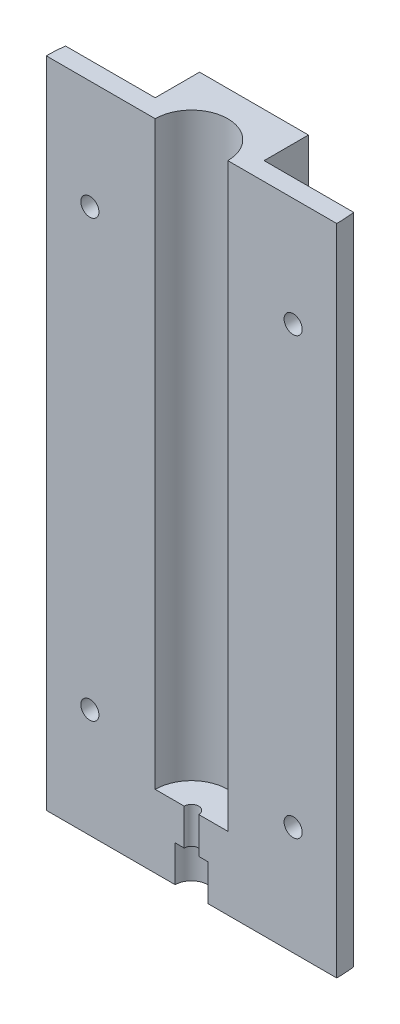
ISO-10303-21;
HEADER;
FILE_DESCRIPTION(('STEP AP214'),'2;1');
FILE_NAME('part.step','',(''),(''),'','','');
FILE_SCHEMA(('AUTOMOTIVE_DESIGN { 1 0 10303 214 1 1 1 1 }'));
ENDSEC;
DATA;
#1=APPLICATION_CONTEXT('core data for automotive mechanical design processes');
#2=APPLICATION_PROTOCOL_DEFINITION('international standard','automotive_design',2000,#1);
#3=PRODUCT_CONTEXT('',#1,'mechanical');
#4=PRODUCT('Part','Part','',(#3));
#5=PRODUCT_RELATED_PRODUCT_CATEGORY('part','',(#4));
#6=PRODUCT_DEFINITION_FORMATION('','',#4);
#7=PRODUCT_DEFINITION_CONTEXT('part definition',#1,'design');
#8=PRODUCT_DEFINITION('design','',#6,#7);
#9=PRODUCT_DEFINITION_SHAPE('','',#8);
#10=(LENGTH_UNIT() NAMED_UNIT(*) SI_UNIT(.MILLI.,.METRE.));
#11=(NAMED_UNIT(*) PLANE_ANGLE_UNIT() SI_UNIT($,.RADIAN.));
#12=(NAMED_UNIT(*) SI_UNIT($,.STERADIAN.) SOLID_ANGLE_UNIT());
#13=UNCERTAINTY_MEASURE_WITH_UNIT(LENGTH_MEASURE(1.E-05),#10,'distance_accuracy_value','');
#14=(GEOMETRIC_REPRESENTATION_CONTEXT(3) GLOBAL_UNCERTAINTY_ASSIGNED_CONTEXT((#13)) GLOBAL_UNIT_ASSIGNED_CONTEXT((#10,
#11,#12)) REPRESENTATION_CONTEXT('',''));
#15=CARTESIAN_POINT('',(0.,0.,0.));
#16=DIRECTION('',(0.,0.,1.));
#17=DIRECTION('',(1.,0.,0.));
#18=AXIS2_PLACEMENT_3D('',#15,#16,#17);
#19=CARTESIAN_POINT('',(20.,-0.0001,0.));
#20=DIRECTION('',(0.,1.,0.));
#21=DIRECTION('',(0.,0.,1.));
#22=AXIS2_PLACEMENT_3D('',#19,#20,#21);
#23=CYLINDRICAL_SURFACE('',#22,20.);
#24=DIRECTION('',(0.,1.,0.));
#25=VECTOR('',#24,1.);
#26=CARTESIAN_POINT('',(0.156865167015571,-131.873657205707,-2.5));
#27=LINE('',#26,#25);
#28=CARTESIAN_POINT('',(0.156865167015571,-0.000100000000002876,-2.5));
#29=VERTEX_POINT('',#28);
#30=CARTESIAN_POINT('',(0.156865167015571,90.0000000000001,-2.5));
#31=VERTEX_POINT('',#30);
#32=EDGE_CURVE('E154',#29,#31,#27,.T.);
#33=ORIENTED_EDGE('',*,*,#32,.F.);
#34=CARTESIAN_POINT('',(20.,-0.0001,0.));
#35=DIRECTION('',(0.,1.,0.));
#36=DIRECTION('',(0.,0.,-1.));
#37=AXIS2_PLACEMENT_3D('',#34,#35,#36);
#38=CIRCLE('',#37,20.);
#39=CARTESIAN_POINT('',(0.,-0.0001,0.));
#40=VERTEX_POINT('',#39);
#41=EDGE_CURVE('E160',#29,#40,#38,.T.);
#42=ORIENTED_EDGE('',*,*,#41,.T.);
#43=DIRECTION('',(0.,1.,0.));
#44=VECTOR('',#43,1.);
#45=CARTESIAN_POINT('',(0.,-0.0001,0.));
#46=LINE('',#45,#44);
#47=CARTESIAN_POINT('',(0.,90.0000000000001,0.));
#48=VERTEX_POINT('',#47);
#49=EDGE_CURVE('E169',#40,#48,#46,.T.);
#50=ORIENTED_EDGE('',*,*,#49,.T.);
#51=CARTESIAN_POINT('',(20.,90.0000000000001,0.));
#52=DIRECTION('',(0.,1.,0.));
#53=DIRECTION('',(0.,0.,-1.));
#54=AXIS2_PLACEMENT_3D('',#51,#52,#53);
#55=CIRCLE('',#54,20.);
#56=EDGE_CURVE('E242',#31,#48,#55,.T.);
#57=ORIENTED_EDGE('',*,*,#56,.F.);
#58=EDGE_LOOP('',(#33,#42,#50,#57));
#59=FACE_BOUND('',#58,.T.);
#60=ADVANCED_FACE('F33',(#59),#23,.T.);
#61=CARTESIAN_POINT('',(20.,-31.3608864858859,0.));
#62=DIRECTION('',(0.,1.,0.));
#63=DIRECTION('',(0.,0.,1.));
#64=AXIS2_PLACEMENT_3D('',#61,#62,#63);
#65=CYLINDRICAL_SURFACE('',#64,0.999999999999999);
#66=CARTESIAN_POINT('',(20.,4.99989999999999,0.));
#67=DIRECTION('',(0.,-1.,0.));
#68=DIRECTION('',(0.,0.,-1.));
#69=AXIS2_PLACEMENT_3D('',#66,#67,#68);
#70=CIRCLE('',#69,0.999999999999999);
#71=CARTESIAN_POINT('',(21.,4.99989999999999,0.));
#72=VERTEX_POINT('',#71);
#73=CARTESIAN_POINT('',(19.,4.99989999999999,0.));
#74=VERTEX_POINT('',#73);
#75=EDGE_CURVE('E171',#72,#74,#70,.F.);
#76=ORIENTED_EDGE('',*,*,#75,.F.);
#77=DIRECTION('',(0.,1.,0.));
#78=VECTOR('',#77,1.);
#79=CARTESIAN_POINT('',(21.,-31.3608864858859,0.));
#80=LINE('',#79,#78);
#81=CARTESIAN_POINT('',(21.,10.,0.));
#82=VERTEX_POINT('',#81);
#83=EDGE_CURVE('E227',#72,#82,#80,.T.);
#84=ORIENTED_EDGE('',*,*,#83,.T.);
#85=CARTESIAN_POINT('',(20.,10.,0.));
#86=DIRECTION('',(0.,1.,0.));
#87=DIRECTION('',(0.,0.,-1.));
#88=AXIS2_PLACEMENT_3D('',#85,#86,#87);
#89=CIRCLE('',#88,0.999999999999999);
#90=CARTESIAN_POINT('',(19.,10.,0.));
#91=VERTEX_POINT('',#90);
#92=EDGE_CURVE('E223',#82,#91,#89,.T.);
#93=ORIENTED_EDGE('',*,*,#92,.T.);
#94=DIRECTION('',(0.,1.,0.));
#95=VECTOR('',#94,1.);
#96=CARTESIAN_POINT('',(19.,-31.3608864858859,0.));
#97=LINE('',#96,#95);
#98=EDGE_CURVE('E226',#74,#91,#97,.T.);
#99=ORIENTED_EDGE('',*,*,#98,.F.);
#100=EDGE_LOOP('',(#76,#84,#93,#99));
#101=FACE_BOUND('',#100,.T.);
#102=ADVANCED_FACE('F278',(#101),#65,.F.);
#103=CARTESIAN_POINT('',(0.,-0.0001,0.));
#104=DIRECTION('',(0.,0.,1.));
#105=DIRECTION('',(1.,0.,0.));
#106=AXIS2_PLACEMENT_3D('',#103,#104,#105);
#107=PLANE('',#106);
#108=CARTESIAN_POINT('',(34.,75.0000000000001,0.));
#109=DIRECTION('',(0.,0.,1.));
#110=DIRECTION('',(1.,0.,0.));
#111=AXIS2_PLACEMENT_3D('',#108,#109,#110);
#112=CIRCLE('',#111,1.24999999999999);
#113=CARTESIAN_POINT('',(35.25,75.0000000000001,0.));
#114=VERTEX_POINT('',#113);
#115=EDGE_CURVE('E313',#114,#114,#112,.T.);
#116=ORIENTED_EDGE('',*,*,#115,.F.);
#117=EDGE_LOOP('',(#116));
#118=FACE_BOUND('',#117,.T.);
#119=CARTESIAN_POINT('',(34.,15.,0.));
#120=DIRECTION('',(0.,0.,1.));
#121=DIRECTION('',(1.,0.,0.));
#122=AXIS2_PLACEMENT_3D('',#119,#120,#121);
#123=CIRCLE('',#122,1.24999999999999);
#124=CARTESIAN_POINT('',(35.25,15.,0.));
#125=VERTEX_POINT('',#124);
#126=EDGE_CURVE('E324',#125,#125,#123,.T.);
#127=ORIENTED_EDGE('',*,*,#126,.F.);
#128=EDGE_LOOP('',(#127));
#129=FACE_BOUND('',#128,.T.);
#130=DIRECTION('',(0.,-1.,0.));
#131=VECTOR('',#130,1.);
#132=CARTESIAN_POINT('',(22.25,4.99989999999999,0.));
#133=LINE('',#132,#131);
#134=CARTESIAN_POINT('',(22.25,-0.0001,0.));
#135=VERTEX_POINT('',#134);
#136=CARTESIAN_POINT('',(22.25,4.99989999999999,0.));
#137=VERTEX_POINT('',#136);
#138=EDGE_CURVE('E221',#135,#137,#133,.F.);
#139=ORIENTED_EDGE('',*,*,#138,.F.);
#140=DIRECTION('',(1.,0.,0.));
#141=VECTOR('',#140,1.);
#142=CARTESIAN_POINT('',(0.,-0.0001,0.));
#143=LINE('',#142,#141);
#144=CARTESIAN_POINT('',(40.,-0.0001,0.));
#145=VERTEX_POINT('',#144);
#146=EDGE_CURVE('E159',#135,#145,#143,.T.);
#147=ORIENTED_EDGE('',*,*,#146,.T.);
#148=DIRECTION('',(0.,1.,0.));
#149=VECTOR('',#148,1.);
#150=CARTESIAN_POINT('',(40.,-0.0001,0.));
#151=LINE('',#150,#149);
#152=CARTESIAN_POINT('',(40.,90.0000000000001,0.));
#153=VERTEX_POINT('',#152);
#154=EDGE_CURVE('E158',#145,#153,#151,.T.);
#155=ORIENTED_EDGE('',*,*,#154,.T.);
#156=DIRECTION('',(1.,0.,0.));
#157=VECTOR('',#156,1.);
#158=CARTESIAN_POINT('',(0.,90.0000000000001,0.));
#159=LINE('',#158,#157);
#160=CARTESIAN_POINT('',(25.,90.0000000000001,0.));
#161=VERTEX_POINT('',#160);
#162=EDGE_CURVE('E245',#161,#153,#159,.T.);
#163=ORIENTED_EDGE('',*,*,#162,.F.);
#164=DIRECTION('',(0.,1.,0.));
#165=VECTOR('',#164,1.);
#166=CARTESIAN_POINT('',(25.,10.,0.));
#167=LINE('',#166,#165);
#168=CARTESIAN_POINT('',(25.,10.,0.));
#169=VERTEX_POINT('',#168);
#170=EDGE_CURVE('E240',#169,#161,#167,.T.);
#171=ORIENTED_EDGE('',*,*,#170,.F.);
#172=DIRECTION('',(-1.,0.,0.));
#173=VECTOR('',#172,1.);
#174=CARTESIAN_POINT('',(25.,10.,0.));
#175=LINE('',#174,#173);
#176=EDGE_CURVE('E235',#169,#82,#175,.T.);
#177=ORIENTED_EDGE('',*,*,#176,.T.);
#178=ORIENTED_EDGE('',*,*,#83,.F.);
#179=DIRECTION('',(1.,0.,0.));
#180=VECTOR('',#179,1.);
#181=CARTESIAN_POINT('',(0.,4.99989999999999,0.));
#182=LINE('',#181,#180);
#183=EDGE_CURVE('E56',#72,#137,#182,.T.);
#184=ORIENTED_EDGE('',*,*,#183,.T.);
#185=EDGE_LOOP('',(#139,#147,#155,#163,#171,#177,#178,#184));
#186=FACE_BOUND('',#185,.T.);
#187=ADVANCED_FACE('F269',(#118,#129,#186),#107,.T.);
#188=DIRECTION('',(0.,1.,0.));
#189=VECTOR('',#188,1.);
#190=CARTESIAN_POINT('',(39.8431348329844,-131.873657205707,-2.5));
#191=LINE('',#190,#189);
#192=CARTESIAN_POINT('',(39.8431348329844,-0.000100000000002876,-2.5));
#193=VERTEX_POINT('',#192);
#194=CARTESIAN_POINT('',(39.8431348329844,90.0000000000001,-2.5));
#195=VERTEX_POINT('',#194);
#196=EDGE_CURVE('E133',#193,#195,#191,.T.);
#197=ORIENTED_EDGE('',*,*,#196,.T.);
#198=EDGE_CURVE('E244',#153,#195,#55,.T.);
#199=ORIENTED_EDGE('',*,*,#198,.F.);
#200=ORIENTED_EDGE('',*,*,#154,.F.);
#201=EDGE_CURVE('E151',#145,#193,#38,.T.);
#202=ORIENTED_EDGE('',*,*,#201,.T.);
#203=EDGE_LOOP('',(#197,#199,#200,#202));
#204=FACE_BOUND('',#203,.T.);
#205=ADVANCED_FACE('F35',(#204),#23,.T.);
#206=CARTESIAN_POINT('',(6.,75.0000000000001,0.));
#207=DIRECTION('',(0.,0.,1.));
#208=DIRECTION('',(1.,0.,0.));
#209=AXIS2_PLACEMENT_3D('',#206,#207,#208);
#210=CIRCLE('',#209,1.24999999999999);
#211=CARTESIAN_POINT('',(7.24999999999999,75.0000000000001,0.));
#212=VERTEX_POINT('',#211);
#213=EDGE_CURVE('E304',#212,#212,#210,.T.);
#214=ORIENTED_EDGE('',*,*,#213,.F.);
#215=EDGE_LOOP('',(#214));
#216=FACE_BOUND('',#215,.T.);
#217=CARTESIAN_POINT('',(6.,15.,0.));
#218=DIRECTION('',(0.,0.,1.));
#219=DIRECTION('',(1.,0.,0.));
#220=AXIS2_PLACEMENT_3D('',#217,#218,#219);
#221=CIRCLE('',#220,1.24999999999999);
#222=CARTESIAN_POINT('',(7.24999999999999,15.,0.));
#223=VERTEX_POINT('',#222);
#224=EDGE_CURVE('E307',#223,#223,#221,.T.);
#225=ORIENTED_EDGE('',*,*,#224,.F.);
#226=EDGE_LOOP('',(#225));
#227=FACE_BOUND('',#226,.T.);
#228=DIRECTION('',(0.,-1.,0.));
#229=VECTOR('',#228,1.);
#230=CARTESIAN_POINT('',(17.75,4.99989999999999,0.));
#231=LINE('',#230,#229);
#232=CARTESIAN_POINT('',(17.75,4.99989999999999,0.));
#233=VERTEX_POINT('',#232);
#234=CARTESIAN_POINT('',(17.75,-0.0001,0.));
#235=VERTEX_POINT('',#234);
#236=EDGE_CURVE('E219',#233,#235,#231,.T.);
#237=ORIENTED_EDGE('',*,*,#236,.F.);
#238=DIRECTION('',(1.,0.,0.));
#239=VECTOR('',#238,1.);
#240=CARTESIAN_POINT('',(0.,4.99989999999999,0.));
#241=LINE('',#240,#239);
#242=EDGE_CURVE('E214',#233,#74,#241,.T.);
#243=ORIENTED_EDGE('',*,*,#242,.T.);
#244=ORIENTED_EDGE('',*,*,#98,.T.);
#245=CARTESIAN_POINT('',(15.,10.,0.));
#246=VERTEX_POINT('',#245);
#247=EDGE_CURVE('E234',#91,#246,#175,.T.);
#248=ORIENTED_EDGE('',*,*,#247,.T.);
#249=DIRECTION('',(0.,1.,0.));
#250=VECTOR('',#249,1.);
#251=CARTESIAN_POINT('',(15.,10.,0.));
#252=LINE('',#251,#250);
#253=CARTESIAN_POINT('',(15.,90.0000000000001,0.));
#254=VERTEX_POINT('',#253);
#255=EDGE_CURVE('E238',#246,#254,#252,.T.);
#256=ORIENTED_EDGE('',*,*,#255,.T.);
#257=EDGE_CURVE('E164',#48,#254,#159,.T.);
#258=ORIENTED_EDGE('',*,*,#257,.F.);
#259=ORIENTED_EDGE('',*,*,#49,.F.);
#260=EDGE_CURVE('E162',#40,#235,#143,.T.);
#261=ORIENTED_EDGE('',*,*,#260,.T.);
#262=EDGE_LOOP('',(#237,#243,#244,#248,#256,#258,#259,#261));
#263=FACE_BOUND('',#262,.T.);
#264=ADVANCED_FACE('F256',(#216,#227,#263),#107,.T.);
#265=CARTESIAN_POINT('',(20.,-0.0001,0.));
#266=DIRECTION('',(0.,-1.,0.));
#267=DIRECTION('',(0.,0.,-1.));
#268=AXIS2_PLACEMENT_3D('',#265,#266,#267);
#269=PLANE('',#268);
#270=DIRECTION('',(-1.,0.,0.));
#271=VECTOR('',#270,1.);
#272=CARTESIAN_POINT('',(20.,-0.0001,-2.5));
#273=LINE('',#272,#271);
#274=CARTESIAN_POINT('',(12.5,-0.000100000000002876,-2.5));
#275=VERTEX_POINT('',#274);
#276=EDGE_CURVE('E209',#275,#29,#273,.T.);
#277=ORIENTED_EDGE('',*,*,#276,.F.);
#278=DIRECTION('',(0.,0.,1.));
#279=VECTOR('',#278,1.);
#280=CARTESIAN_POINT('',(12.5,-0.0001,0.));
#281=LINE('',#280,#279);
#282=CARTESIAN_POINT('',(12.5,-0.000100000000002876,-8.61));
#283=VERTEX_POINT('',#282);
#284=EDGE_CURVE('E207',#283,#275,#281,.T.);
#285=ORIENTED_EDGE('',*,*,#284,.F.);
#286=DIRECTION('',(-1.,0.,0.));
#287=VECTOR('',#286,1.);
#288=CARTESIAN_POINT('',(20.,-0.0001,-8.61));
#289=LINE('',#288,#287);
#290=CARTESIAN_POINT('',(27.5,-0.000100000000002876,-8.61));
#291=VERTEX_POINT('',#290);
#292=EDGE_CURVE('E198',#291,#283,#289,.T.);
#293=ORIENTED_EDGE('',*,*,#292,.F.);
#294=DIRECTION('',(0.,0.,-1.));
#295=VECTOR('',#294,1.);
#296=CARTESIAN_POINT('',(27.5,-0.0001,0.));
#297=LINE('',#296,#295);
#298=CARTESIAN_POINT('',(27.5,-0.000100000000002876,-2.5));
#299=VERTEX_POINT('',#298);
#300=EDGE_CURVE('E153',#299,#291,#297,.T.);
#301=ORIENTED_EDGE('',*,*,#300,.F.);
#302=DIRECTION('',(-1.,0.,0.));
#303=VECTOR('',#302,1.);
#304=CARTESIAN_POINT('',(20.,-0.0001,-2.5));
#305=LINE('',#304,#303);
#306=EDGE_CURVE('E136',#193,#299,#305,.T.);
#307=ORIENTED_EDGE('',*,*,#306,.F.);
#308=ORIENTED_EDGE('',*,*,#201,.F.);
#309=ORIENTED_EDGE('',*,*,#146,.F.);
#310=CARTESIAN_POINT('',(20.,-0.0001,0.));
#311=DIRECTION('',(0.,-1.,0.));
#312=DIRECTION('',(0.,0.,-1.));
#313=AXIS2_PLACEMENT_3D('',#310,#311,#312);
#314=CIRCLE('',#313,2.25);
#315=EDGE_CURVE('E211',#235,#135,#314,.T.);
#316=ORIENTED_EDGE('',*,*,#315,.F.);
#317=ORIENTED_EDGE('',*,*,#260,.F.);
#318=ORIENTED_EDGE('',*,*,#41,.F.);
#319=EDGE_LOOP('',(#277,#285,#293,#301,#307,#308,#309,#316,#317,#318));
#320=FACE_BOUND('',#319,.T.);
#321=ADVANCED_FACE('F149',(#320),#269,.T.);
#322=CARTESIAN_POINT('',(20.,90.0000000000001,0.));
#323=DIRECTION('',(0.,-1.,0.));
#324=DIRECTION('',(0.,0.,-1.));
#325=AXIS2_PLACEMENT_3D('',#322,#323,#324);
#326=PLANE('',#325);
#327=DIRECTION('',(0.,0.,1.));
#328=VECTOR('',#327,1.);
#329=CARTESIAN_POINT('',(12.5,90.0000000000001,0.));
#330=LINE('',#329,#328);
#331=CARTESIAN_POINT('',(12.5,90.0000000000001,-8.61));
#332=VERTEX_POINT('',#331);
#333=CARTESIAN_POINT('',(12.5,90.0000000000001,-2.5));
#334=VERTEX_POINT('',#333);
#335=EDGE_CURVE('E41',#332,#334,#330,.T.);
#336=ORIENTED_EDGE('',*,*,#335,.T.);
#337=DIRECTION('',(-1.,0.,0.));
#338=VECTOR('',#337,1.);
#339=CARTESIAN_POINT('',(20.,90.0000000000001,-2.5));
#340=LINE('',#339,#338);
#341=EDGE_CURVE('E11',#334,#31,#340,.T.);
#342=ORIENTED_EDGE('',*,*,#341,.T.);
#343=ORIENTED_EDGE('',*,*,#56,.T.);
#344=ORIENTED_EDGE('',*,*,#257,.T.);
#345=CARTESIAN_POINT('',(20.,90.0000000000001,0.));
#346=DIRECTION('',(0.,1.,0.));
#347=DIRECTION('',(0.,0.,1.));
#348=AXIS2_PLACEMENT_3D('',#345,#346,#347);
#349=CIRCLE('',#348,5.);
#350=EDGE_CURVE('E229',#161,#254,#349,.T.);
#351=ORIENTED_EDGE('',*,*,#350,.F.);
#352=ORIENTED_EDGE('',*,*,#162,.T.);
#353=ORIENTED_EDGE('',*,*,#198,.T.);
#354=DIRECTION('',(-1.,0.,0.));
#355=VECTOR('',#354,1.);
#356=CARTESIAN_POINT('',(20.,90.0000000000001,-2.5));
#357=LINE('',#356,#355);
#358=CARTESIAN_POINT('',(27.5,90.0000000000001,-2.5));
#359=VERTEX_POINT('',#358);
#360=EDGE_CURVE('E138',#195,#359,#357,.T.);
#361=ORIENTED_EDGE('',*,*,#360,.T.);
#362=DIRECTION('',(0.,0.,-1.));
#363=VECTOR('',#362,1.);
#364=CARTESIAN_POINT('',(27.5,90.0000000000001,0.));
#365=LINE('',#364,#363);
#366=CARTESIAN_POINT('',(27.5,90.0000000000001,-8.61));
#367=VERTEX_POINT('',#366);
#368=EDGE_CURVE('E176',#359,#367,#365,.T.);
#369=ORIENTED_EDGE('',*,*,#368,.T.);
#370=DIRECTION('',(-1.,0.,0.));
#371=VECTOR('',#370,1.);
#372=CARTESIAN_POINT('',(20.,90.0000000000001,-8.61));
#373=LINE('',#372,#371);
#374=EDGE_CURVE('E179',#367,#332,#373,.T.);
#375=ORIENTED_EDGE('',*,*,#374,.T.);
#376=EDGE_LOOP('',(#336,#342,#343,#344,#351,#352,#353,#361,#369,#375));
#377=FACE_BOUND('',#376,.T.);
#378=ADVANCED_FACE('F183',(#377),#326,.F.);
#379=CARTESIAN_POINT('',(20.,10.,0.));
#380=DIRECTION('',(0.,1.,0.));
#381=DIRECTION('',(0.,0.,1.));
#382=AXIS2_PLACEMENT_3D('',#379,#380,#381);
#383=CYLINDRICAL_SURFACE('',#382,5.);
#384=ORIENTED_EDGE('',*,*,#350,.T.);
#385=ORIENTED_EDGE('',*,*,#255,.F.);
#386=CARTESIAN_POINT('',(20.,10.,0.));
#387=DIRECTION('',(0.,1.,0.));
#388=DIRECTION('',(0.,0.,1.));
#389=AXIS2_PLACEMENT_3D('',#386,#387,#388);
#390=CIRCLE('',#389,5.);
#391=EDGE_CURVE('E231',#169,#246,#390,.T.);
#392=ORIENTED_EDGE('',*,*,#391,.F.);
#393=ORIENTED_EDGE('',*,*,#170,.T.);
#394=EDGE_LOOP('',(#384,#385,#392,#393));
#395=FACE_BOUND('',#394,.T.);
#396=ADVANCED_FACE('F261',(#395),#383,.F.);
#397=CARTESIAN_POINT('',(20.,10.,0.));
#398=DIRECTION('',(0.,1.,0.));
#399=DIRECTION('',(0.,0.,1.));
#400=AXIS2_PLACEMENT_3D('',#397,#398,#399);
#401=PLANE('',#400);
#402=ORIENTED_EDGE('',*,*,#92,.F.);
#403=ORIENTED_EDGE('',*,*,#176,.F.);
#404=ORIENTED_EDGE('',*,*,#391,.T.);
#405=ORIENTED_EDGE('',*,*,#247,.F.);
#406=EDGE_LOOP('',(#402,#403,#404,#405));
#407=FACE_BOUND('',#406,.T.);
#408=ADVANCED_FACE('F265',(#407),#401,.T.);
#409=CARTESIAN_POINT('',(20.,4.99989999999999,0.));
#410=DIRECTION('',(0.,-1.,0.));
#411=DIRECTION('',(0.,0.,-1.));
#412=AXIS2_PLACEMENT_3D('',#409,#410,#411);
#413=CYLINDRICAL_SURFACE('',#412,2.25);
#414=ORIENTED_EDGE('',*,*,#138,.T.);
#415=CARTESIAN_POINT('',(20.,4.99989999999999,0.));
#416=DIRECTION('',(0.,-1.,0.));
#417=DIRECTION('',(0.,0.,-1.));
#418=AXIS2_PLACEMENT_3D('',#415,#416,#417);
#419=CIRCLE('',#418,2.25);
#420=EDGE_CURVE('E212',#233,#137,#419,.T.);
#421=ORIENTED_EDGE('',*,*,#420,.F.);
#422=ORIENTED_EDGE('',*,*,#236,.T.);
#423=ORIENTED_EDGE('',*,*,#315,.T.);
#424=EDGE_LOOP('',(#414,#421,#422,#423));
#425=FACE_BOUND('',#424,.T.);
#426=ADVANCED_FACE('F275',(#425),#413,.F.);
#427=CARTESIAN_POINT('',(20.,4.99989999999999,0.));
#428=DIRECTION('',(0.,-1.,0.));
#429=DIRECTION('',(0.,0.,-1.));
#430=AXIS2_PLACEMENT_3D('',#427,#428,#429);
#431=PLANE('',#430);
#432=ORIENTED_EDGE('',*,*,#75,.T.);
#433=ORIENTED_EDGE('',*,*,#242,.F.);
#434=ORIENTED_EDGE('',*,*,#420,.T.);
#435=ORIENTED_EDGE('',*,*,#183,.F.);
#436=EDGE_LOOP('',(#432,#433,#434,#435));
#437=FACE_BOUND('',#436,.T.);
#438=ADVANCED_FACE('F276',(#437),#431,.T.);
#439=CARTESIAN_POINT('',(0.156865167015571,-131.873657205707,-2.5));
#440=DIRECTION('',(0.,0.,1.));
#441=DIRECTION('',(1.,0.,0.));
#442=AXIS2_PLACEMENT_3D('',#439,#440,#441);
#443=PLANE('',#442);
#444=CARTESIAN_POINT('',(6.,75.0000000000001,-2.5));
#445=DIRECTION('',(0.,0.,1.));
#446=DIRECTION('',(1.,0.,0.));
#447=AXIS2_PLACEMENT_3D('',#444,#445,#446);
#448=CIRCLE('',#447,1.24999999999999);
#449=CARTESIAN_POINT('',(7.24999999999999,75.0000000000001,-2.5));
#450=VERTEX_POINT('',#449);
#451=EDGE_CURVE('E310',#450,#450,#448,.T.);
#452=ORIENTED_EDGE('',*,*,#451,.T.);
#453=EDGE_LOOP('',(#452));
#454=FACE_BOUND('',#453,.T.);
#455=CARTESIAN_POINT('',(6.,15.,-2.5));
#456=DIRECTION('',(0.,0.,1.));
#457=DIRECTION('',(1.,0.,0.));
#458=AXIS2_PLACEMENT_3D('',#455,#456,#457);
#459=CIRCLE('',#458,1.24999999999999);
#460=CARTESIAN_POINT('',(7.24999999999999,15.,-2.5));
#461=VERTEX_POINT('',#460);
#462=EDGE_CURVE('E309',#461,#461,#459,.T.);
#463=ORIENTED_EDGE('',*,*,#462,.T.);
#464=EDGE_LOOP('',(#463));
#465=FACE_BOUND('',#464,.T.);
#466=DIRECTION('',(0.,1.,0.));
#467=VECTOR('',#466,1.);
#468=CARTESIAN_POINT('',(12.5,-131.873657205707,-2.5));
#469=LINE('',#468,#467);
#470=EDGE_CURVE('E193',#275,#334,#469,.T.);
#471=ORIENTED_EDGE('',*,*,#470,.F.);
#472=ORIENTED_EDGE('',*,*,#276,.T.);
#473=ORIENTED_EDGE('',*,*,#32,.T.);
#474=ORIENTED_EDGE('',*,*,#341,.F.);
#475=EDGE_LOOP('',(#471,#472,#473,#474));
#476=FACE_BOUND('',#475,.T.);
#477=ADVANCED_FACE('F356',(#454,#465,#476),#443,.F.);
#478=CARTESIAN_POINT('',(12.5,-131.873657205707,-2.5));
#479=DIRECTION('',(1.,0.,0.));
#480=DIRECTION('',(0.,0.,-1.));
#481=AXIS2_PLACEMENT_3D('',#478,#479,#480);
#482=PLANE('',#481);
#483=DIRECTION('',(0.,1.,0.));
#484=VECTOR('',#483,1.);
#485=CARTESIAN_POINT('',(12.5,-131.873657205707,-8.61));
#486=LINE('',#485,#484);
#487=EDGE_CURVE('E190',#283,#332,#486,.T.);
#488=ORIENTED_EDGE('',*,*,#487,.F.);
#489=ORIENTED_EDGE('',*,*,#284,.T.);
#490=ORIENTED_EDGE('',*,*,#470,.T.);
#491=ORIENTED_EDGE('',*,*,#335,.F.);
#492=EDGE_LOOP('',(#488,#489,#490,#491));
#493=FACE_BOUND('',#492,.T.);
#494=ADVANCED_FACE('F189',(#493),#482,.F.);
#495=CARTESIAN_POINT('',(12.5,-131.873657205707,-8.61));
#496=DIRECTION('',(0.,0.,1.));
#497=DIRECTION('',(1.,0.,0.));
#498=AXIS2_PLACEMENT_3D('',#495,#496,#497);
#499=PLANE('',#498);
#500=DIRECTION('',(0.,1.,0.));
#501=VECTOR('',#500,1.);
#502=CARTESIAN_POINT('',(27.5,-131.873657205707,-8.61));
#503=LINE('',#502,#501);
#504=EDGE_CURVE('E143',#291,#367,#503,.T.);
#505=ORIENTED_EDGE('',*,*,#504,.F.);
#506=ORIENTED_EDGE('',*,*,#292,.T.);
#507=ORIENTED_EDGE('',*,*,#487,.T.);
#508=ORIENTED_EDGE('',*,*,#374,.F.);
#509=EDGE_LOOP('',(#505,#506,#507,#508));
#510=FACE_BOUND('',#509,.T.);
#511=ADVANCED_FACE('F196',(#510),#499,.F.);
#512=CARTESIAN_POINT('',(27.5,-131.873657205707,-8.61));
#513=DIRECTION('',(-1.,0.,0.));
#514=DIRECTION('',(0.,0.,1.));
#515=AXIS2_PLACEMENT_3D('',#512,#513,#514);
#516=PLANE('',#515);
#517=DIRECTION('',(0.,1.,0.));
#518=VECTOR('',#517,1.);
#519=CARTESIAN_POINT('',(27.5,-131.873657205707,-2.5));
#520=LINE('',#519,#518);
#521=EDGE_CURVE('E48',#299,#359,#520,.T.);
#522=ORIENTED_EDGE('',*,*,#521,.F.);
#523=ORIENTED_EDGE('',*,*,#300,.T.);
#524=ORIENTED_EDGE('',*,*,#504,.T.);
#525=ORIENTED_EDGE('',*,*,#368,.F.);
#526=EDGE_LOOP('',(#522,#523,#524,#525));
#527=FACE_BOUND('',#526,.T.);
#528=ADVANCED_FACE('F344',(#527),#516,.F.);
#529=CARTESIAN_POINT('',(27.5,-131.873657205707,-2.5));
#530=DIRECTION('',(0.,0.,1.));
#531=DIRECTION('',(1.,0.,0.));
#532=AXIS2_PLACEMENT_3D('',#529,#530,#531);
#533=PLANE('',#532);
#534=CARTESIAN_POINT('',(34.,75.0000000000001,-2.5));
#535=DIRECTION('',(0.,0.,1.));
#536=DIRECTION('',(1.,0.,0.));
#537=AXIS2_PLACEMENT_3D('',#534,#535,#536);
#538=CIRCLE('',#537,1.24999999999999);
#539=CARTESIAN_POINT('',(35.25,75.0000000000001,-2.5));
#540=VERTEX_POINT('',#539);
#541=EDGE_CURVE('E321',#540,#540,#538,.T.);
#542=ORIENTED_EDGE('',*,*,#541,.T.);
#543=EDGE_LOOP('',(#542));
#544=FACE_BOUND('',#543,.T.);
#545=CARTESIAN_POINT('',(34.,15.,-2.5));
#546=DIRECTION('',(0.,0.,1.));
#547=DIRECTION('',(1.,0.,0.));
#548=AXIS2_PLACEMENT_3D('',#545,#546,#547);
#549=CIRCLE('',#548,1.24999999999999);
#550=CARTESIAN_POINT('',(35.25,15.,-2.5));
#551=VERTEX_POINT('',#550);
#552=EDGE_CURVE('E327',#551,#551,#549,.T.);
#553=ORIENTED_EDGE('',*,*,#552,.T.);
#554=EDGE_LOOP('',(#553));
#555=FACE_BOUND('',#554,.T.);
#556=ORIENTED_EDGE('',*,*,#196,.F.);
#557=ORIENTED_EDGE('',*,*,#306,.T.);
#558=ORIENTED_EDGE('',*,*,#521,.T.);
#559=ORIENTED_EDGE('',*,*,#360,.F.);
#560=EDGE_LOOP('',(#556,#557,#558,#559));
#561=FACE_BOUND('',#560,.T.);
#562=ADVANCED_FACE('F135',(#544,#555,#561),#533,.F.);
#563=CARTESIAN_POINT('',(34.,15.,0.));
#564=DIRECTION('',(0.,0.,1.));
#565=DIRECTION('',(1.,0.,0.));
#566=AXIS2_PLACEMENT_3D('',#563,#564,#565);
#567=CYLINDRICAL_SURFACE('',#566,1.24999999999999);
#568=ORIENTED_EDGE('',*,*,#126,.T.);
#569=EDGE_LOOP('',(#568));
#570=FACE_BOUND('',#569,.T.);
#571=ORIENTED_EDGE('',*,*,#552,.F.);
#572=EDGE_LOOP('',(#571));
#573=FACE_BOUND('',#572,.T.);
#574=ADVANCED_FACE('F332',(#570,#573),#567,.F.);
#575=CARTESIAN_POINT('',(34.,75.0000000000001,0.));
#576=DIRECTION('',(0.,0.,1.));
#577=DIRECTION('',(1.,0.,0.));
#578=AXIS2_PLACEMENT_3D('',#575,#576,#577);
#579=CYLINDRICAL_SURFACE('',#578,1.24999999999999);
#580=ORIENTED_EDGE('',*,*,#115,.T.);
#581=EDGE_LOOP('',(#580));
#582=FACE_BOUND('',#581,.T.);
#583=ORIENTED_EDGE('',*,*,#541,.F.);
#584=EDGE_LOOP('',(#583));
#585=FACE_BOUND('',#584,.T.);
#586=ADVANCED_FACE('F334',(#582,#585),#579,.F.);
#587=CARTESIAN_POINT('',(6.,15.,0.));
#588=DIRECTION('',(0.,0.,1.));
#589=DIRECTION('',(1.,0.,0.));
#590=AXIS2_PLACEMENT_3D('',#587,#588,#589);
#591=CYLINDRICAL_SURFACE('',#590,1.24999999999999);
#592=ORIENTED_EDGE('',*,*,#224,.T.);
#593=EDGE_LOOP('',(#592));
#594=FACE_BOUND('',#593,.T.);
#595=ORIENTED_EDGE('',*,*,#462,.F.);
#596=EDGE_LOOP('',(#595));
#597=FACE_BOUND('',#596,.T.);
#598=ADVANCED_FACE('F341',(#594,#597),#591,.F.);
#599=CARTESIAN_POINT('',(6.,75.0000000000001,0.));
#600=DIRECTION('',(0.,0.,1.));
#601=DIRECTION('',(1.,0.,0.));
#602=AXIS2_PLACEMENT_3D('',#599,#600,#601);
#603=CYLINDRICAL_SURFACE('',#602,1.24999999999999);
#604=ORIENTED_EDGE('',*,*,#213,.T.);
#605=EDGE_LOOP('',(#604));
#606=FACE_BOUND('',#605,.T.);
#607=ORIENTED_EDGE('',*,*,#451,.F.);
#608=EDGE_LOOP('',(#607));
#609=FACE_BOUND('',#608,.T.);
#610=ADVANCED_FACE('F456',(#606,#609),#603,.F.);
#611=CLOSED_SHELL('',(#60,#102,#187,#205,#264,#321,#378,#396,#408,#426,#438,#477,#494,#511,#528,
#562,#574,#586,#598,#610));
#612=MANIFOLD_SOLID_BREP('B2',#611);
#613=ADVANCED_BREP_SHAPE_REPRESENTATION('',(#18,#612),#14);
#614=SHAPE_DEFINITION_REPRESENTATION(#9,#613);
ENDSEC;
END-ISO-10303-21;
